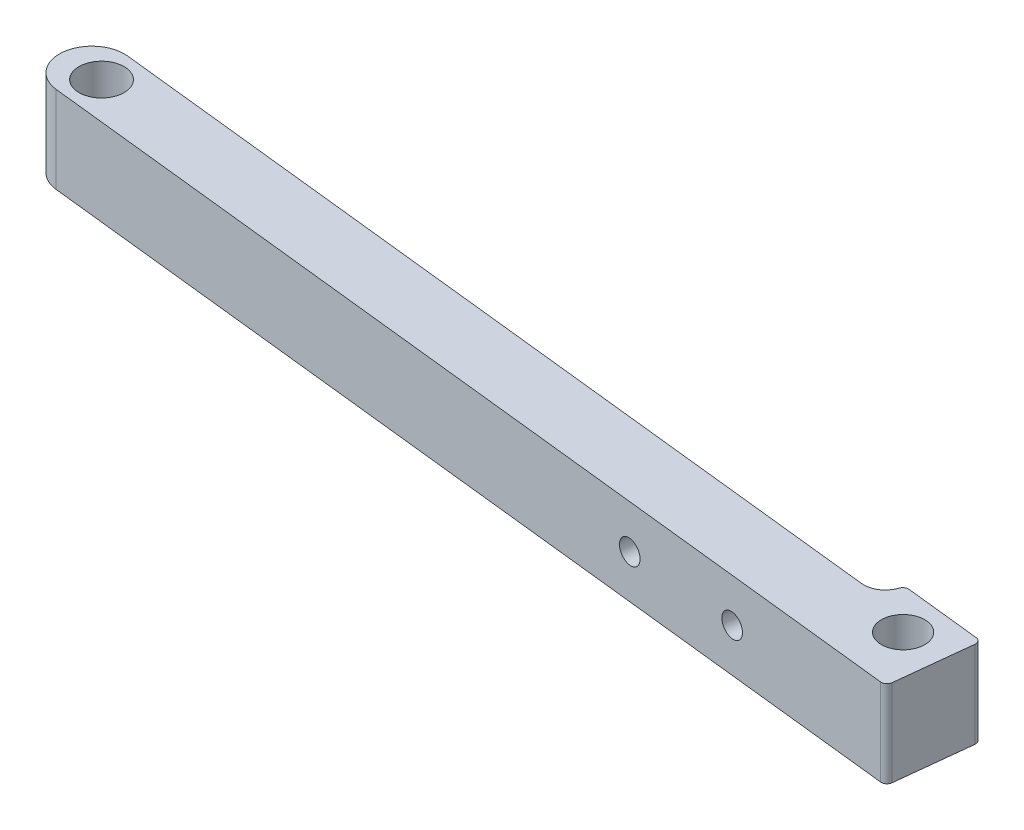
ISO-10303-21;
HEADER;
FILE_DESCRIPTION(('STEP AP214'),'2;1');
FILE_NAME('part.step','',(''),(''),'','','');
FILE_SCHEMA(('AUTOMOTIVE_DESIGN { 1 0 10303 214 1 1 1 1 }'));
ENDSEC;
DATA;
#1=APPLICATION_CONTEXT('core data for automotive mechanical design processes');
#2=APPLICATION_PROTOCOL_DEFINITION('international standard','automotive_design',2000,#1);
#3=PRODUCT_CONTEXT('',#1,'mechanical');
#4=PRODUCT('Part','Part','',(#3));
#5=PRODUCT_RELATED_PRODUCT_CATEGORY('part','',(#4));
#6=PRODUCT_DEFINITION_FORMATION('','',#4);
#7=PRODUCT_DEFINITION_CONTEXT('part definition',#1,'design');
#8=PRODUCT_DEFINITION('design','',#6,#7);
#9=PRODUCT_DEFINITION_SHAPE('','',#8);
#10=(LENGTH_UNIT() NAMED_UNIT(*) SI_UNIT(.MILLI.,.METRE.));
#11=(NAMED_UNIT(*) PLANE_ANGLE_UNIT() SI_UNIT($,.RADIAN.));
#12=(NAMED_UNIT(*) SI_UNIT($,.STERADIAN.) SOLID_ANGLE_UNIT());
#13=UNCERTAINTY_MEASURE_WITH_UNIT(LENGTH_MEASURE(1.E-05),#10,'distance_accuracy_value','');
#14=(GEOMETRIC_REPRESENTATION_CONTEXT(3) GLOBAL_UNCERTAINTY_ASSIGNED_CONTEXT((#13)) GLOBAL_UNIT_ASSIGNED_CONTEXT((#10,
#11,#12)) REPRESENTATION_CONTEXT('',''));
#15=CARTESIAN_POINT('',(0.,0.,0.));
#16=DIRECTION('',(0.,0.,1.));
#17=DIRECTION('',(1.,0.,0.));
#18=AXIS2_PLACEMENT_3D('',#15,#16,#17);
#19=CARTESIAN_POINT('',(0.,19.05,0.));
#20=DIRECTION('',(0.,-1.,0.));
#21=DIRECTION('',(0.,0.,-1.));
#22=AXIS2_PLACEMENT_3D('',#19,#20,#21);
#23=PLANE('',#22);
#24=CARTESIAN_POINT('',(162.325137460303,19.05,55.1858504327486));
#25=DIRECTION('',(0.,1.,0.));
#26=DIRECTION('',(0.,0.,1.));
#27=AXIS2_PLACEMENT_3D('',#24,#25,#26);
#28=CIRCLE('',#27,4.7625);
#29=CARTESIAN_POINT('',(162.325137460303,19.05,59.9483504327486));
#30=VERTEX_POINT('',#29);
#31=EDGE_CURVE('E210',#30,#30,#28,.T.);
#32=ORIENTED_EDGE('',*,*,#31,.F.);
#33=EDGE_LOOP('',(#32));
#34=FACE_BOUND('',#33,.T.);
#35=DIRECTION('',(0.994102291378644,0.,0.108446458105969));
#36=VECTOR('',#35,1.);
#37=CARTESIAN_POINT('',(170.588850519982,19.05,67.2657646591532));
#38=LINE('',#37,#36);
#39=CARTESIAN_POINT('',(-34.0350165133408,19.05,44.9433801156714));
#40=VERTEX_POINT('',#39);
#41=CARTESIAN_POINT('',(169.326340609931,19.05,67.1280376573586));
#42=VERTEX_POINT('',#41);
#43=EDGE_CURVE('E196',#40,#42,#38,.T.);
#44=ORIENTED_EDGE('',*,*,#43,.T.);
#45=CARTESIAN_POINT('',(169.464067611725,19.05,65.8655277473077));
#46=DIRECTION('',(0.,-1.,0.));
#47=DIRECTION('',(0.,0.,-1.));
#48=AXIS2_PLACEMENT_3D('',#45,#46,#47);
#49=CIRCLE('',#48,1.27);
#50=CARTESIAN_POINT('',(170.726577521776,19.05,66.0032547491023));
#51=VERTEX_POINT('',#50);
#52=EDGE_CURVE('E178',#42,#51,#49,.F.);
#53=ORIENTED_EDGE('',*,*,#52,.T.);
#54=DIRECTION('',(0.108446458105968,0.,-0.994102291378644));
#55=VECTOR('',#54,1.);
#56=CARTESIAN_POINT('',(172.6547555469,19.05,48.32811600839));
#57=LINE('',#56,#55);
#58=CARTESIAN_POINT('',(172.517028545106,19.05,49.5906259184408));
#59=VERTEX_POINT('',#58);
#60=EDGE_CURVE('E140',#51,#59,#57,.T.);
#61=ORIENTED_EDGE('',*,*,#60,.T.);
#62=CARTESIAN_POINT('',(171.254518635055,19.05,49.4528989166463));
#63=DIRECTION('',(0.,-1.,0.));
#64=DIRECTION('',(0.,0.,-1.));
#65=AXIS2_PLACEMENT_3D('',#62,#63,#64);
#66=CIRCLE('',#65,1.27);
#67=CARTESIAN_POINT('',(171.392245636849,19.05,48.1903890065954));
#68=VERTEX_POINT('',#67);
#69=EDGE_CURVE('E176',#59,#68,#66,.F.);
#70=ORIENTED_EDGE('',*,*,#69,.T.);
#71=DIRECTION('',(-0.994102291378644,0.,-0.108446458105969));
#72=VECTOR('',#71,1.);
#73=CARTESIAN_POINT('',(-39.0707297304583,19.05,25.2310170798137));
#74=LINE('',#73,#72);
#75=CARTESIAN_POINT('',(154.845214931583,19.05,46.3852761045134));
#76=VERTEX_POINT('',#75);
#77=EDGE_CURVE('E138',#68,#76,#74,.T.);
#78=ORIENTED_EDGE('',*,*,#77,.T.);
#79=CARTESIAN_POINT('',(154.707487929788,19.05,47.6477860145643));
#80=DIRECTION('',(0.,-1.,0.));
#81=DIRECTION('',(0.,0.,-1.));
#82=AXIS2_PLACEMENT_3D('',#79,#80,#81);
#83=CIRCLE('',#82,1.27);
#84=CARTESIAN_POINT('',(153.502268309506,19.05,47.2473541640752));
#85=VERTEX_POINT('',#84);
#86=EDGE_CURVE('E56',#76,#85,#83,.F.);
#87=ORIENTED_EDGE('',*,*,#86,.T.);
#88=CARTESIAN_POINT('',(148.982694733446,19.05,45.7457347247415));
#89=DIRECTION('',(0.,-1.,0.));
#90=DIRECTION('',(0.,0.,-1.));
#91=AXIS2_PLACEMENT_3D('',#88,#89,#90);
#92=CIRCLE('',#91,4.7625);
#93=CARTESIAN_POINT('',(148.466218476717,19.05,50.4801468874322));
#94=VERTEX_POINT('',#93);
#95=EDGE_CURVE('E115',#85,#94,#92,.T.);
#96=ORIENTED_EDGE('',*,*,#95,.T.);
#97=DIRECTION('',(0.994102291378644,0.,0.108446458105968));
#98=VECTOR('',#97,1.);
#99=CARTESIAN_POINT('',(-39.587205987188,19.05,29.9654292425045));
#100=LINE('',#99,#98);
#101=CARTESIAN_POINT('',(-32.4855877431518,19.05,30.740143627599));
#102=VERTEX_POINT('',#101);
#103=EDGE_CURVE('E119',#102,#94,#100,.T.);
#104=ORIENTED_EDGE('',*,*,#103,.F.);
#105=CARTESIAN_POINT('',(-33.2603021282463,19.05,37.8417618716352));
#106=DIRECTION('',(0.,-1.,0.));
#107=DIRECTION('',(0.,0.,-1.));
#108=AXIS2_PLACEMENT_3D('',#105,#106,#107);
#109=CIRCLE('',#108,7.14375);
#110=CARTESIAN_POINT('',(-40.3619203722825,19.05,37.0670474865406));
#111=VERTEX_POINT('',#110);
#112=EDGE_CURVE('E154',#102,#111,#109,.F.);
#113=ORIENTED_EDGE('',*,*,#112,.T.);
#114=CARTESIAN_POINT('',(-33.2603021282463,19.05,37.8417618716352));
#115=DIRECTION('',(0.,-1.,0.));
#116=DIRECTION('',(0.,0.,-1.));
#117=AXIS2_PLACEMENT_3D('',#114,#115,#116);
#118=CIRCLE('',#117,7.14375);
#119=EDGE_CURVE('E156',#111,#40,#118,.F.);
#120=ORIENTED_EDGE('',*,*,#119,.T.);
#121=EDGE_LOOP('',(#44,#53,#61,#70,#78,#87,#96,#104,#113,#120));
#122=FACE_BOUND('',#121,.T.);
#123=CARTESIAN_POINT('',(-30.8930960469009,19.05,38.1));
#124=DIRECTION('',(0.,1.,0.));
#125=DIRECTION('',(0.,0.,1.));
#126=AXIS2_PLACEMENT_3D('',#123,#124,#125);
#127=CIRCLE('',#126,4.96062);
#128=CARTESIAN_POINT('',(-30.8930960469009,19.05,43.06062));
#129=VERTEX_POINT('',#128);
#130=EDGE_CURVE('E228',#129,#129,#127,.T.);
#131=ORIENTED_EDGE('',*,*,#130,.F.);
#132=EDGE_LOOP('',(#131));
#133=FACE_BOUND('',#132,.T.);
#134=ADVANCED_FACE('F41',(#34,#122,#133),#23,.F.);
#135=CARTESIAN_POINT('',(0.,0.,0.));
#136=DIRECTION('',(0.,-1.,0.));
#137=DIRECTION('',(0.,0.,-1.));
#138=AXIS2_PLACEMENT_3D('',#135,#136,#137);
#139=PLANE('',#138);
#140=CARTESIAN_POINT('',(162.325137460303,0.,55.1858504327486));
#141=DIRECTION('',(0.,1.,0.));
#142=DIRECTION('',(0.,0.,1.));
#143=AXIS2_PLACEMENT_3D('',#140,#141,#142);
#144=CIRCLE('',#143,4.7625);
#145=CARTESIAN_POINT('',(162.325137460303,0.,59.9483504327486));
#146=VERTEX_POINT('',#145);
#147=EDGE_CURVE('E203',#146,#146,#144,.T.);
#148=ORIENTED_EDGE('',*,*,#147,.T.);
#149=EDGE_LOOP('',(#148));
#150=FACE_BOUND('',#149,.T.);
#151=DIRECTION('',(0.108446458105968,0.,-0.994102291378644));
#152=VECTOR('',#151,1.);
#153=CARTESIAN_POINT('',(172.6547555469,0.,48.32811600839));
#154=LINE('',#153,#152);
#155=CARTESIAN_POINT('',(170.726577521776,0.,66.0032547491023));
#156=VERTEX_POINT('',#155);
#157=CARTESIAN_POINT('',(172.517028545106,0.,49.5906259184408));
#158=VERTEX_POINT('',#157);
#159=EDGE_CURVE('E197',#156,#158,#154,.T.);
#160=ORIENTED_EDGE('',*,*,#159,.F.);
#161=CARTESIAN_POINT('',(169.464067611725,0.,65.8655277473077));
#162=DIRECTION('',(0.,-1.,0.));
#163=DIRECTION('',(0.,0.,-1.));
#164=AXIS2_PLACEMENT_3D('',#161,#162,#163);
#165=CIRCLE('',#164,1.27);
#166=CARTESIAN_POINT('',(169.326340609931,0.,67.1280376573586));
#167=VERTEX_POINT('',#166);
#168=EDGE_CURVE('E171',#156,#167,#165,.T.);
#169=ORIENTED_EDGE('',*,*,#168,.T.);
#170=DIRECTION('',(0.994102291378644,0.,0.108446458105969));
#171=VECTOR('',#170,1.);
#172=CARTESIAN_POINT('',(170.588850519982,0.,67.2657646591532));
#173=LINE('',#172,#171);
#174=CARTESIAN_POINT('',(-34.0350165133408,0.,44.9433801156714));
#175=VERTEX_POINT('',#174);
#176=EDGE_CURVE('E199',#175,#167,#173,.T.);
#177=ORIENTED_EDGE('',*,*,#176,.F.);
#178=CARTESIAN_POINT('',(-33.2603021282463,0.,37.8417618716352));
#179=DIRECTION('',(0.,-1.,0.));
#180=DIRECTION('',(0.,0.,-1.));
#181=AXIS2_PLACEMENT_3D('',#178,#179,#180);
#182=CIRCLE('',#181,7.14375);
#183=CARTESIAN_POINT('',(-40.3619203722825,0.,37.0670474865406));
#184=VERTEX_POINT('',#183);
#185=EDGE_CURVE('E152',#175,#184,#182,.T.);
#186=ORIENTED_EDGE('',*,*,#185,.T.);
#187=CARTESIAN_POINT('',(-33.2603021282463,0.,37.8417618716352));
#188=DIRECTION('',(0.,-1.,0.));
#189=DIRECTION('',(0.,0.,-1.));
#190=AXIS2_PLACEMENT_3D('',#187,#188,#189);
#191=CIRCLE('',#190,7.14375);
#192=CARTESIAN_POINT('',(-32.4855877431518,0.,30.740143627599));
#193=VERTEX_POINT('',#192);
#194=EDGE_CURVE('E150',#184,#193,#191,.T.);
#195=ORIENTED_EDGE('',*,*,#194,.T.);
#196=DIRECTION('',(0.994102291378644,0.,0.108446458105968));
#197=VECTOR('',#196,1.);
#198=CARTESIAN_POINT('',(-39.587205987188,0.,29.9654292425045));
#199=LINE('',#198,#197);
#200=CARTESIAN_POINT('',(148.466218476717,0.,50.4801468874322));
#201=VERTEX_POINT('',#200);
#202=EDGE_CURVE('E133',#193,#201,#199,.T.);
#203=ORIENTED_EDGE('',*,*,#202,.T.);
#204=CARTESIAN_POINT('',(148.982694733446,0.,45.7457347247415));
#205=DIRECTION('',(0.,-1.,0.));
#206=DIRECTION('',(0.,0.,-1.));
#207=AXIS2_PLACEMENT_3D('',#204,#205,#206);
#208=CIRCLE('',#207,4.7625);
#209=CARTESIAN_POINT('',(153.502268309506,0.,47.2473541640752));
#210=VERTEX_POINT('',#209);
#211=EDGE_CURVE('E123',#201,#210,#208,.F.);
#212=ORIENTED_EDGE('',*,*,#211,.T.);
#213=CARTESIAN_POINT('',(154.707487929788,0.,47.6477860145643));
#214=DIRECTION('',(0.,-1.,0.));
#215=DIRECTION('',(0.,0.,-1.));
#216=AXIS2_PLACEMENT_3D('',#213,#214,#215);
#217=CIRCLE('',#216,1.27);
#218=CARTESIAN_POINT('',(154.845214931583,0.,46.3852761045134));
#219=VERTEX_POINT('',#218);
#220=EDGE_CURVE('E167',#210,#219,#217,.T.);
#221=ORIENTED_EDGE('',*,*,#220,.T.);
#222=DIRECTION('',(-0.994102291378644,0.,-0.108446458105969));
#223=VECTOR('',#222,1.);
#224=CARTESIAN_POINT('',(-39.0707297304583,0.,25.2310170798137));
#225=LINE('',#224,#223);
#226=CARTESIAN_POINT('',(171.392245636849,0.,48.1903890065954));
#227=VERTEX_POINT('',#226);
#228=EDGE_CURVE('E143',#227,#219,#225,.T.);
#229=ORIENTED_EDGE('',*,*,#228,.F.);
#230=CARTESIAN_POINT('',(171.254518635055,0.,49.4528989166463));
#231=DIRECTION('',(0.,-1.,0.));
#232=DIRECTION('',(0.,0.,-1.));
#233=AXIS2_PLACEMENT_3D('',#230,#231,#232);
#234=CIRCLE('',#233,1.27);
#235=EDGE_CURVE('E169',#227,#158,#234,.T.);
#236=ORIENTED_EDGE('',*,*,#235,.T.);
#237=EDGE_LOOP('',(#160,#169,#177,#186,#195,#203,#212,#221,#229,#236));
#238=FACE_BOUND('',#237,.T.);
#239=CARTESIAN_POINT('',(-30.8930960469009,0.,38.1));
#240=DIRECTION('',(0.,1.,0.));
#241=DIRECTION('',(0.,0.,1.));
#242=AXIS2_PLACEMENT_3D('',#239,#240,#241);
#243=CIRCLE('',#242,4.96062);
#244=CARTESIAN_POINT('',(-30.8930960469009,0.,43.06062));
#245=VERTEX_POINT('',#244);
#246=EDGE_CURVE('E225',#245,#245,#243,.T.);
#247=ORIENTED_EDGE('',*,*,#246,.T.);
#248=EDGE_LOOP('',(#247));
#249=FACE_BOUND('',#248,.T.);
#250=ADVANCED_FACE('F192',(#150,#238,#249),#139,.T.);
#251=CARTESIAN_POINT('',(170.588850519982,19.05,67.2657646591532));
#252=DIRECTION('',(0.108446458105969,0.,-0.994102291378644));
#253=DIRECTION('',(-0.994102291378644,0.,-0.108446458105969));
#254=AXIS2_PLACEMENT_3D('',#251,#252,#253);
#255=PLANE('',#254);
#256=CARTESIAN_POINT('',(132.713553218455,9.525,63.1339546053158));
#257=DIRECTION('',(-0.108446458105969,0.,0.994102291378644));
#258=DIRECTION('',(0.994102291378644,0.,0.108446458105969));
#259=AXIS2_PLACEMENT_3D('',#256,#257,#258);
#260=CIRCLE('',#259,2.5527);
#261=CARTESIAN_POINT('',(135.251198137657,9.525,63.4107858789229));
#262=VERTEX_POINT('',#261);
#263=EDGE_CURVE('E222',#262,#262,#260,.T.);
#264=ORIENTED_EDGE('',*,*,#263,.F.);
#265=EDGE_LOOP('',(#264));
#266=FACE_BOUND('',#265,.T.);
#267=CARTESIAN_POINT('',(107.463355017438,9.52499999999999,60.3794145694242));
#268=DIRECTION('',(-0.108446458105969,0.,0.994102291378644));
#269=DIRECTION('',(0.994102291378644,0.,0.108446458105969));
#270=AXIS2_PLACEMENT_3D('',#267,#268,#269);
#271=CIRCLE('',#270,2.5527);
#272=CARTESIAN_POINT('',(110.00099993664,9.52499999999999,60.6562458430313));
#273=VERTEX_POINT('',#272);
#274=EDGE_CURVE('E216',#273,#273,#271,.T.);
#275=ORIENTED_EDGE('',*,*,#274,.F.);
#276=EDGE_LOOP('',(#275));
#277=FACE_BOUND('',#276,.T.);
#278=ORIENTED_EDGE('',*,*,#176,.T.);
#279=DIRECTION('',(0.,-1.,0.));
#280=VECTOR('',#279,1.);
#281=CARTESIAN_POINT('',(169.326340609931,19.05,67.1280376573586));
#282=LINE('',#281,#280);
#283=EDGE_CURVE('E173',#167,#42,#282,.F.);
#284=ORIENTED_EDGE('',*,*,#283,.T.);
#285=ORIENTED_EDGE('',*,*,#43,.F.);
#286=DIRECTION('',(0.,-1.,0.));
#287=VECTOR('',#286,1.);
#288=CARTESIAN_POINT('',(-34.0350165133408,19.05,44.9433801156714));
#289=LINE('',#288,#287);
#290=EDGE_CURVE('E147',#40,#175,#289,.T.);
#291=ORIENTED_EDGE('',*,*,#290,.T.);
#292=EDGE_LOOP('',(#278,#284,#285,#291));
#293=FACE_BOUND('',#292,.T.);
#294=ADVANCED_FACE('F240',(#266,#277,#293),#255,.F.);
#295=CARTESIAN_POINT('',(172.6547555469,19.05,48.32811600839));
#296=DIRECTION('',(-0.994102291378644,0.,-0.108446458105968));
#297=DIRECTION('',(-0.108446458105968,0.,0.994102291378644));
#298=AXIS2_PLACEMENT_3D('',#295,#296,#297);
#299=PLANE('',#298);
#300=ORIENTED_EDGE('',*,*,#60,.F.);
#301=DIRECTION('',(0.,-1.,0.));
#302=VECTOR('',#301,1.);
#303=CARTESIAN_POINT('',(170.726577521776,19.05,66.0032547491023));
#304=LINE('',#303,#302);
#305=EDGE_CURVE('E164',#51,#156,#304,.T.);
#306=ORIENTED_EDGE('',*,*,#305,.T.);
#307=ORIENTED_EDGE('',*,*,#159,.T.);
#308=DIRECTION('',(0.,-1.,0.));
#309=VECTOR('',#308,1.);
#310=CARTESIAN_POINT('',(172.517028545106,19.05,49.5906259184408));
#311=LINE('',#310,#309);
#312=EDGE_CURVE('E159',#158,#59,#311,.F.);
#313=ORIENTED_EDGE('',*,*,#312,.T.);
#314=EDGE_LOOP('',(#300,#306,#307,#313));
#315=FACE_BOUND('',#314,.T.);
#316=ADVANCED_FACE('F250',(#315),#299,.F.);
#317=CARTESIAN_POINT('',(-39.0707297304583,19.05,25.2310170798137));
#318=DIRECTION('',(-0.108446458105969,0.,0.994102291378644));
#319=DIRECTION('',(0.994102291378644,0.,0.108446458105969));
#320=AXIS2_PLACEMENT_3D('',#317,#318,#319);
#321=PLANE('',#320);
#322=ORIENTED_EDGE('',*,*,#77,.F.);
#323=DIRECTION('',(0.,-1.,0.));
#324=VECTOR('',#323,1.);
#325=CARTESIAN_POINT('',(171.392245636849,19.05,48.1903890065954));
#326=LINE('',#325,#324);
#327=EDGE_CURVE('E49',#68,#227,#326,.T.);
#328=ORIENTED_EDGE('',*,*,#327,.T.);
#329=ORIENTED_EDGE('',*,*,#228,.T.);
#330=DIRECTION('',(0.,-1.,0.));
#331=VECTOR('',#330,1.);
#332=CARTESIAN_POINT('',(154.845214931583,19.05,46.3852761045134));
#333=LINE('',#332,#331);
#334=EDGE_CURVE('E180',#219,#76,#333,.F.);
#335=ORIENTED_EDGE('',*,*,#334,.T.);
#336=EDGE_LOOP('',(#322,#328,#329,#335));
#337=FACE_BOUND('',#336,.T.);
#338=ADVANCED_FACE('F187',(#337),#321,.F.);
#339=CARTESIAN_POINT('',(162.325137460303,19.05,55.1858504327486));
#340=DIRECTION('',(0.,1.,0.));
#341=DIRECTION('',(0.,0.,1.));
#342=AXIS2_PLACEMENT_3D('',#339,#340,#341);
#343=CYLINDRICAL_SURFACE('',#342,4.7625);
#344=ORIENTED_EDGE('',*,*,#147,.F.);
#345=EDGE_LOOP('',(#344));
#346=FACE_BOUND('',#345,.T.);
#347=ORIENTED_EDGE('',*,*,#31,.T.);
#348=EDGE_LOOP('',(#347));
#349=FACE_BOUND('',#348,.T.);
#350=ADVANCED_FACE('F245',(#346,#349),#343,.F.);
#351=CARTESIAN_POINT('',(-39.587205987188,0.,29.9654292425045));
#352=DIRECTION('',(-0.108446458105968,0.,0.994102291378644));
#353=DIRECTION('',(0.994102291378644,0.,0.108446458105968));
#354=AXIS2_PLACEMENT_3D('',#351,#352,#353);
#355=PLANE('',#354);
#356=CARTESIAN_POINT('',(134.262981988644,9.525,48.9307181172432));
#357=DIRECTION('',(-0.108446458105968,0.,0.994102291378644));
#358=DIRECTION('',(0.994102291378644,0.,0.108446458105968));
#359=AXIS2_PLACEMENT_3D('',#356,#357,#358);
#360=CIRCLE('',#359,2.5527);
#361=CARTESIAN_POINT('',(136.800626907846,9.525,49.2075493908503));
#362=VERTEX_POINT('',#361);
#363=EDGE_CURVE('E219',#362,#362,#360,.T.);
#364=ORIENTED_EDGE('',*,*,#363,.T.);
#365=EDGE_LOOP('',(#364));
#366=FACE_BOUND('',#365,.T.);
#367=CARTESIAN_POINT('',(109.012783787627,9.52499999999999,46.1761780813516));
#368=DIRECTION('',(-0.108446458105968,0.,0.994102291378644));
#369=DIRECTION('',(0.994102291378644,0.,0.108446458105968));
#370=AXIS2_PLACEMENT_3D('',#367,#368,#369);
#371=CIRCLE('',#370,2.5527);
#372=CARTESIAN_POINT('',(111.550428706829,9.52499999999999,46.4530093549587));
#373=VERTEX_POINT('',#372);
#374=EDGE_CURVE('E162',#373,#373,#371,.T.);
#375=ORIENTED_EDGE('',*,*,#374,.T.);
#376=EDGE_LOOP('',(#375));
#377=FACE_BOUND('',#376,.T.);
#378=ORIENTED_EDGE('',*,*,#202,.F.);
#379=DIRECTION('',(0.,1.,0.));
#380=VECTOR('',#379,1.);
#381=CARTESIAN_POINT('',(-32.4855877431518,0.,30.740143627599));
#382=LINE('',#381,#380);
#383=EDGE_CURVE('E132',#193,#102,#382,.T.);
#384=ORIENTED_EDGE('',*,*,#383,.T.);
#385=ORIENTED_EDGE('',*,*,#103,.T.);
#386=DIRECTION('',(0.,1.,0.));
#387=VECTOR('',#386,1.);
#388=CARTESIAN_POINT('',(148.466218476717,0.,50.4801468874322));
#389=LINE('',#388,#387);
#390=EDGE_CURVE('E124',#94,#201,#389,.F.);
#391=ORIENTED_EDGE('',*,*,#390,.T.);
#392=EDGE_LOOP('',(#378,#384,#385,#391));
#393=FACE_BOUND('',#392,.T.);
#394=ADVANCED_FACE('F129',(#366,#377,#393),#355,.F.);
#395=CARTESIAN_POINT('',(148.982694733446,0.,45.7457347247415));
#396=DIRECTION('',(0.,-1.,0.));
#397=DIRECTION('',(0.,0.,-1.));
#398=AXIS2_PLACEMENT_3D('',#395,#396,#397);
#399=CYLINDRICAL_SURFACE('',#398,4.7625);
#400=ORIENTED_EDGE('',*,*,#95,.F.);
#401=DIRECTION('',(0.,-1.,0.));
#402=VECTOR('',#401,1.);
#403=CARTESIAN_POINT('',(153.502268309506,0.,47.2473541640752));
#404=LINE('',#403,#402);
#405=EDGE_CURVE('E11',#85,#210,#404,.T.);
#406=ORIENTED_EDGE('',*,*,#405,.T.);
#407=ORIENTED_EDGE('',*,*,#211,.F.);
#408=ORIENTED_EDGE('',*,*,#390,.F.);
#409=EDGE_LOOP('',(#400,#406,#407,#408));
#410=FACE_BOUND('',#409,.T.);
#411=ADVANCED_FACE('F136',(#410),#399,.F.);
#412=CARTESIAN_POINT('',(-33.2603021282463,0.,37.8417618716352));
#413=DIRECTION('',(0.,1.,0.));
#414=DIRECTION('',(0.,0.,1.));
#415=AXIS2_PLACEMENT_3D('',#412,#413,#414);
#416=CYLINDRICAL_SURFACE('',#415,7.14375);
#417=DIRECTION('',(0.,1.,0.));
#418=VECTOR('',#417,1.);
#419=CARTESIAN_POINT('',(-40.3619203722825,19.05,37.0670474865406));
#420=LINE('',#419,#418);
#421=EDGE_CURVE('E134',#111,#184,#420,.F.);
#422=ORIENTED_EDGE('',*,*,#421,.F.);
#423=ORIENTED_EDGE('',*,*,#112,.F.);
#424=ORIENTED_EDGE('',*,*,#383,.F.);
#425=ORIENTED_EDGE('',*,*,#194,.F.);
#426=EDGE_LOOP('',(#422,#423,#424,#425));
#427=FACE_BOUND('',#426,.T.);
#428=ADVANCED_FACE('F258',(#427),#416,.T.);
#429=CARTESIAN_POINT('',(-33.2603021282463,19.05,37.8417618716352));
#430=DIRECTION('',(0.,-1.,0.));
#431=DIRECTION('',(0.,0.,-1.));
#432=AXIS2_PLACEMENT_3D('',#429,#430,#431);
#433=CYLINDRICAL_SURFACE('',#432,7.14375);
#434=ORIENTED_EDGE('',*,*,#119,.F.);
#435=ORIENTED_EDGE('',*,*,#421,.T.);
#436=ORIENTED_EDGE('',*,*,#185,.F.);
#437=ORIENTED_EDGE('',*,*,#290,.F.);
#438=EDGE_LOOP('',(#434,#435,#436,#437));
#439=FACE_BOUND('',#438,.T.);
#440=ADVANCED_FACE('F259',(#439),#433,.T.);
#441=CARTESIAN_POINT('',(169.464067611725,19.05,65.8655277473077));
#442=DIRECTION('',(0.,-1.,0.));
#443=DIRECTION('',(0.,0.,-1.));
#444=AXIS2_PLACEMENT_3D('',#441,#442,#443);
#445=CYLINDRICAL_SURFACE('',#444,1.27);
#446=ORIENTED_EDGE('',*,*,#52,.F.);
#447=ORIENTED_EDGE('',*,*,#283,.F.);
#448=ORIENTED_EDGE('',*,*,#168,.F.);
#449=ORIENTED_EDGE('',*,*,#305,.F.);
#450=EDGE_LOOP('',(#446,#447,#448,#449));
#451=FACE_BOUND('',#450,.T.);
#452=ADVANCED_FACE('F262',(#451),#445,.T.);
#453=CARTESIAN_POINT('',(171.254518635055,19.05,49.4528989166463));
#454=DIRECTION('',(0.,-1.,0.));
#455=DIRECTION('',(0.,0.,-1.));
#456=AXIS2_PLACEMENT_3D('',#453,#454,#455);
#457=CYLINDRICAL_SURFACE('',#456,1.27);
#458=ORIENTED_EDGE('',*,*,#69,.F.);
#459=ORIENTED_EDGE('',*,*,#312,.F.);
#460=ORIENTED_EDGE('',*,*,#235,.F.);
#461=ORIENTED_EDGE('',*,*,#327,.F.);
#462=EDGE_LOOP('',(#458,#459,#460,#461));
#463=FACE_BOUND('',#462,.T.);
#464=ADVANCED_FACE('F268',(#463),#457,.T.);
#465=CARTESIAN_POINT('',(154.707487929788,0.,47.6477860145643));
#466=DIRECTION('',(0.,-1.,0.));
#467=DIRECTION('',(0.,0.,-1.));
#468=AXIS2_PLACEMENT_3D('',#465,#466,#467);
#469=CYLINDRICAL_SURFACE('',#468,1.27);
#470=ORIENTED_EDGE('',*,*,#220,.F.);
#471=ORIENTED_EDGE('',*,*,#405,.F.);
#472=ORIENTED_EDGE('',*,*,#86,.F.);
#473=ORIENTED_EDGE('',*,*,#334,.F.);
#474=EDGE_LOOP('',(#470,#471,#472,#473));
#475=FACE_BOUND('',#474,.T.);
#476=ADVANCED_FACE('F43',(#475),#469,.T.);
#477=CARTESIAN_POINT('',(107.463355017438,9.52499999999999,60.3794145694242));
#478=DIRECTION('',(-0.108446458105969,0.,0.994102291378644));
#479=DIRECTION('',(0.994102291378644,0.,0.108446458105969));
#480=AXIS2_PLACEMENT_3D('',#477,#478,#479);
#481=CYLINDRICAL_SURFACE('',#480,2.5527);
#482=ORIENTED_EDGE('',*,*,#274,.T.);
#483=EDGE_LOOP('',(#482));
#484=FACE_BOUND('',#483,.T.);
#485=ORIENTED_EDGE('',*,*,#374,.F.);
#486=EDGE_LOOP('',(#485));
#487=FACE_BOUND('',#486,.T.);
#488=ADVANCED_FACE('F274',(#484,#487),#481,.F.);
#489=CARTESIAN_POINT('',(132.713553218455,9.525,63.1339546053158));
#490=DIRECTION('',(-0.108446458105969,0.,0.994102291378644));
#491=DIRECTION('',(0.994102291378644,0.,0.108446458105969));
#492=AXIS2_PLACEMENT_3D('',#489,#490,#491);
#493=CYLINDRICAL_SURFACE('',#492,2.5527);
#494=ORIENTED_EDGE('',*,*,#263,.T.);
#495=EDGE_LOOP('',(#494));
#496=FACE_BOUND('',#495,.T.);
#497=ORIENTED_EDGE('',*,*,#363,.F.);
#498=EDGE_LOOP('',(#497));
#499=FACE_BOUND('',#498,.T.);
#500=ADVANCED_FACE('F289',(#496,#499),#493,.F.);
#501=CARTESIAN_POINT('',(-30.8930960469009,19.05,38.1));
#502=DIRECTION('',(0.,1.,0.));
#503=DIRECTION('',(0.,0.,1.));
#504=AXIS2_PLACEMENT_3D('',#501,#502,#503);
#505=CYLINDRICAL_SURFACE('',#504,4.96062);
#506=ORIENTED_EDGE('',*,*,#246,.F.);
#507=EDGE_LOOP('',(#506));
#508=FACE_BOUND('',#507,.T.);
#509=ORIENTED_EDGE('',*,*,#130,.T.);
#510=EDGE_LOOP('',(#509));
#511=FACE_BOUND('',#510,.T.);
#512=ADVANCED_FACE('F232',(#508,#511),#505,.F.);
#513=CLOSED_SHELL('',(#134,#250,#294,#316,#338,#350,#394,#411,#428,#440,#452,#464,#476,#488,
#500,#512));
#514=MANIFOLD_SOLID_BREP('B2',#513);
#515=ADVANCED_BREP_SHAPE_REPRESENTATION('',(#18,#514),#14);
#516=SHAPE_DEFINITION_REPRESENTATION(#9,#515);
ENDSEC;
END-ISO-10303-21;
